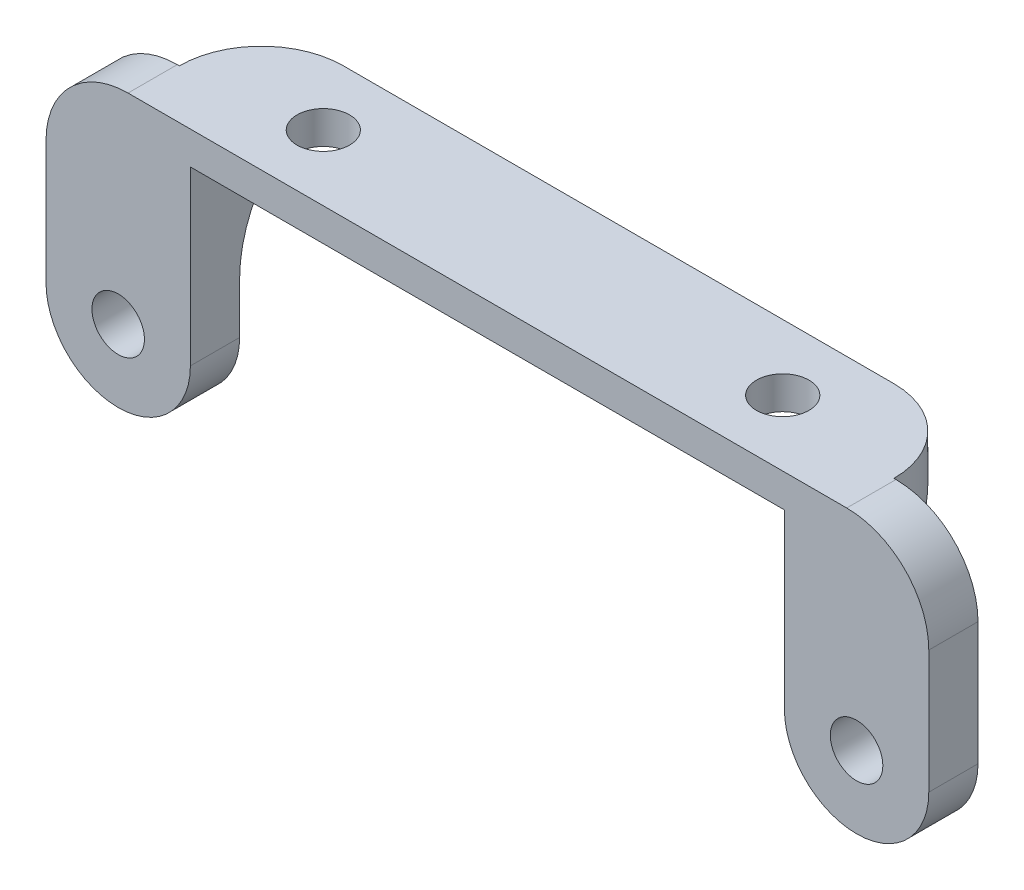
ISO-10303-21;
HEADER;
FILE_DESCRIPTION(('STEP AP214'),'2;1');
FILE_NAME('part.step','',(''),(''),'','','');
FILE_SCHEMA(('AUTOMOTIVE_DESIGN { 1 0 10303 214 1 1 1 1 }'));
ENDSEC;
DATA;
#1=APPLICATION_CONTEXT('core data for automotive mechanical design processes');
#2=APPLICATION_PROTOCOL_DEFINITION('international standard','automotive_design',2000,#1);
#3=PRODUCT_CONTEXT('',#1,'mechanical');
#4=PRODUCT('Part','Part','',(#3));
#5=PRODUCT_RELATED_PRODUCT_CATEGORY('part','',(#4));
#6=PRODUCT_DEFINITION_FORMATION('','',#4);
#7=PRODUCT_DEFINITION_CONTEXT('part definition',#1,'design');
#8=PRODUCT_DEFINITION('design','',#6,#7);
#9=PRODUCT_DEFINITION_SHAPE('','',#8);
#10=(LENGTH_UNIT() NAMED_UNIT(*) SI_UNIT(.MILLI.,.METRE.));
#11=(NAMED_UNIT(*) PLANE_ANGLE_UNIT() SI_UNIT($,.RADIAN.));
#12=(NAMED_UNIT(*) SI_UNIT($,.STERADIAN.) SOLID_ANGLE_UNIT());
#13=UNCERTAINTY_MEASURE_WITH_UNIT(LENGTH_MEASURE(1.E-05),#10,'distance_accuracy_value','');
#14=(GEOMETRIC_REPRESENTATION_CONTEXT(3) GLOBAL_UNCERTAINTY_ASSIGNED_CONTEXT((#13)) GLOBAL_UNIT_ASSIGNED_CONTEXT((#10,
#11,#12)) REPRESENTATION_CONTEXT('',''));
#15=CARTESIAN_POINT('',(0.,0.,0.));
#16=DIRECTION('',(0.,0.,1.));
#17=DIRECTION('',(1.,0.,0.));
#18=AXIS2_PLACEMENT_3D('',#15,#16,#17);
#19=CARTESIAN_POINT('',(0.,10.5,0.));
#20=DIRECTION('',(0.,-1.,0.));
#21=DIRECTION('',(0.,0.,-1.));
#22=AXIS2_PLACEMENT_3D('',#19,#20,#21);
#23=PLANE('',#22);
#24=CARTESIAN_POINT('',(14.,10.5,-0.999999999999999));
#25=DIRECTION('',(0.,1.,0.));
#26=DIRECTION('',(0.,0.,1.));
#27=AXIS2_PLACEMENT_3D('',#24,#25,#26);
#28=CIRCLE('',#27,1.6);
#29=CARTESIAN_POINT('',(14.,10.5,0.600000000000001));
#30=VERTEX_POINT('',#29);
#31=EDGE_CURVE('E198',#30,#30,#28,.T.);
#32=ORIENTED_EDGE('',*,*,#31,.T.);
#33=EDGE_LOOP('',(#32));
#34=FACE_BOUND('',#33,.T.);
#35=CARTESIAN_POINT('',(-14.,10.5,-0.999999999999999));
#36=DIRECTION('',(0.,1.,0.));
#37=DIRECTION('',(0.,0.,1.));
#38=AXIS2_PLACEMENT_3D('',#35,#36,#37);
#39=CIRCLE('',#38,1.6);
#40=CARTESIAN_POINT('',(-14.,10.5,0.600000000000001));
#41=VERTEX_POINT('',#40);
#42=EDGE_CURVE('E192',#41,#41,#39,.T.);
#43=ORIENTED_EDGE('',*,*,#42,.T.);
#44=EDGE_LOOP('',(#43));
#45=FACE_BOUND('',#44,.T.);
#46=DIRECTION('',(0.,0.,-1.));
#47=VECTOR('',#46,1.);
#48=CARTESIAN_POINT('',(-18.1,10.5,3.));
#49=LINE('',#48,#47);
#50=CARTESIAN_POINT('',(-18.1,10.5,3.));
#51=VERTEX_POINT('',#50);
#52=CARTESIAN_POINT('',(-18.1,10.5,-4.82124205988457));
#53=VERTEX_POINT('',#52);
#54=EDGE_CURVE('E241',#51,#53,#49,.T.);
#55=ORIENTED_EDGE('',*,*,#54,.T.);
#56=CARTESIAN_POINT('',(-16.775,10.5,0.));
#57=DIRECTION('',(0.,-1.,0.));
#58=DIRECTION('',(0.,0.,-1.));
#59=AXIS2_PLACEMENT_3D('',#56,#57,#58);
#60=CIRCLE('',#59,5.);
#61=CARTESIAN_POINT('',(-16.775,10.5,-5.));
#62=VERTEX_POINT('',#61);
#63=EDGE_CURVE('E282',#53,#62,#60,.T.);
#64=ORIENTED_EDGE('',*,*,#63,.T.);
#65=DIRECTION('',(-1.,0.,0.));
#66=VECTOR('',#65,1.);
#67=CARTESIAN_POINT('',(-21.775,10.5,-5.));
#68=LINE('',#67,#66);
#69=CARTESIAN_POINT('',(16.775,10.5,-5.));
#70=VERTEX_POINT('',#69);
#71=EDGE_CURVE('E211',#70,#62,#68,.T.);
#72=ORIENTED_EDGE('',*,*,#71,.F.);
#73=CARTESIAN_POINT('',(16.775,10.5,0.));
#74=DIRECTION('',(0.,-1.,0.));
#75=DIRECTION('',(0.,0.,-1.));
#76=AXIS2_PLACEMENT_3D('',#73,#74,#75);
#77=CIRCLE('',#76,5.);
#78=CARTESIAN_POINT('',(18.1,10.5,-4.82124205988457));
#79=VERTEX_POINT('',#78);
#80=EDGE_CURVE('E279',#70,#79,#77,.T.);
#81=ORIENTED_EDGE('',*,*,#80,.T.);
#82=DIRECTION('',(0.,0.,-1.));
#83=VECTOR('',#82,1.);
#84=CARTESIAN_POINT('',(18.1,10.5,3.));
#85=LINE('',#84,#83);
#86=CARTESIAN_POINT('',(18.1,10.5,3.));
#87=VERTEX_POINT('',#86);
#88=EDGE_CURVE('E181',#87,#79,#85,.T.);
#89=ORIENTED_EDGE('',*,*,#88,.F.);
#90=DIRECTION('',(1.,0.,0.));
#91=VECTOR('',#90,1.);
#92=CARTESIAN_POINT('',(12.2208649793369,10.5,3.));
#93=LINE('',#92,#91);
#94=EDGE_CURVE('E204',#51,#87,#93,.T.);
#95=ORIENTED_EDGE('',*,*,#94,.F.);
#96=EDGE_LOOP('',(#55,#64,#72,#81,#89,#95));
#97=FACE_BOUND('',#96,.T.);
#98=ADVANCED_FACE('F39',(#34,#45,#97),#23,.T.);
#99=CARTESIAN_POINT('',(-22.5,0.,3.));
#100=DIRECTION('',(0.,0.,-1.));
#101=DIRECTION('',(-1.,0.,0.));
#102=AXIS2_PLACEMENT_3D('',#99,#100,#101);
#103=CYLINDRICAL_SURFACE('',#102,4.4);
#104=DIRECTION('',(0.,0.,-1.));
#105=VECTOR('',#104,1.);
#106=CARTESIAN_POINT('',(-18.1,0.,3.));
#107=LINE('',#106,#105);
#108=CARTESIAN_POINT('',(-18.1,0.,3.));
#109=VERTEX_POINT('',#108);
#110=CARTESIAN_POINT('',(-18.1,0.,0.));
#111=VERTEX_POINT('',#110);
#112=EDGE_CURVE('E243',#109,#111,#107,.T.);
#113=ORIENTED_EDGE('',*,*,#112,.F.);
#114=CARTESIAN_POINT('',(-22.5,0.,3.));
#115=DIRECTION('',(0.,0.,1.));
#116=DIRECTION('',(-1.,0.,0.));
#117=AXIS2_PLACEMENT_3D('',#114,#115,#116);
#118=CIRCLE('',#117,4.4);
#119=CARTESIAN_POINT('',(-26.9,0.,3.));
#120=VERTEX_POINT('',#119);
#121=EDGE_CURVE('E253',#120,#109,#118,.T.);
#122=ORIENTED_EDGE('',*,*,#121,.F.);
#123=DIRECTION('',(0.,0.,-1.));
#124=VECTOR('',#123,1.);
#125=CARTESIAN_POINT('',(-26.9,0.,3.));
#126=LINE('',#125,#124);
#127=CARTESIAN_POINT('',(-26.9,0.,0.));
#128=VERTEX_POINT('',#127);
#129=EDGE_CURVE('E236',#120,#128,#126,.T.);
#130=ORIENTED_EDGE('',*,*,#129,.T.);
#131=CARTESIAN_POINT('',(-22.5,0.,0.));
#132=DIRECTION('',(0.,0.,1.));
#133=DIRECTION('',(-1.,0.,0.));
#134=AXIS2_PLACEMENT_3D('',#131,#132,#133);
#135=CIRCLE('',#134,4.4);
#136=EDGE_CURVE('E250',#128,#111,#135,.T.);
#137=ORIENTED_EDGE('',*,*,#136,.T.);
#138=EDGE_LOOP('',(#113,#122,#130,#137));
#139=FACE_BOUND('',#138,.T.);
#140=ADVANCED_FACE('F339',(#139),#103,.T.);
#141=CARTESIAN_POINT('',(-22.5,0.,3.));
#142=DIRECTION('',(0.,0.,-1.));
#143=DIRECTION('',(-1.,0.,0.));
#144=AXIS2_PLACEMENT_3D('',#141,#142,#143);
#145=PLANE('',#144);
#146=DIRECTION('',(0.,-1.,0.));
#147=VECTOR('',#146,1.);
#148=CARTESIAN_POINT('',(26.9,12.5,3.));
#149=LINE('',#148,#147);
#150=CARTESIAN_POINT('',(26.9,7.5,3.));
#151=VERTEX_POINT('',#150);
#152=CARTESIAN_POINT('',(26.9,0.,3.));
#153=VERTEX_POINT('',#152);
#154=EDGE_CURVE('E228',#151,#153,#149,.T.);
#155=ORIENTED_EDGE('',*,*,#154,.F.);
#156=CARTESIAN_POINT('',(21.9,7.5,3.));
#157=DIRECTION('',(0.,0.,-1.));
#158=DIRECTION('',(-1.,0.,0.));
#159=AXIS2_PLACEMENT_3D('',#156,#157,#158);
#160=CIRCLE('',#159,5.);
#161=CARTESIAN_POINT('',(21.9,12.5,3.));
#162=VERTEX_POINT('',#161);
#163=EDGE_CURVE('E273',#151,#162,#160,.F.);
#164=ORIENTED_EDGE('',*,*,#163,.T.);
#165=DIRECTION('',(1.,0.,0.));
#166=VECTOR('',#165,1.);
#167=CARTESIAN_POINT('',(-12.2208649793369,12.5,3.));
#168=LINE('',#167,#166);
#169=CARTESIAN_POINT('',(-21.9,12.5,3.));
#170=VERTEX_POINT('',#169);
#171=EDGE_CURVE('E210',#170,#162,#168,.T.);
#172=ORIENTED_EDGE('',*,*,#171,.F.);
#173=CARTESIAN_POINT('',(-21.9,7.5,3.));
#174=DIRECTION('',(0.,0.,-1.));
#175=DIRECTION('',(-1.,0.,0.));
#176=AXIS2_PLACEMENT_3D('',#173,#174,#175);
#177=CIRCLE('',#176,5.);
#178=CARTESIAN_POINT('',(-26.9,7.5,3.));
#179=VERTEX_POINT('',#178);
#180=EDGE_CURVE('E271',#170,#179,#177,.F.);
#181=ORIENTED_EDGE('',*,*,#180,.T.);
#182=DIRECTION('',(0.,-1.,0.));
#183=VECTOR('',#182,1.);
#184=CARTESIAN_POINT('',(-26.9,0.,3.));
#185=LINE('',#184,#183);
#186=EDGE_CURVE('E233',#179,#120,#185,.T.);
#187=ORIENTED_EDGE('',*,*,#186,.T.);
#188=ORIENTED_EDGE('',*,*,#121,.T.);
#189=DIRECTION('',(0.,1.,0.));
#190=VECTOR('',#189,1.);
#191=CARTESIAN_POINT('',(-18.1,10.5,3.));
#192=LINE('',#191,#190);
#193=EDGE_CURVE('E231',#109,#51,#192,.T.);
#194=ORIENTED_EDGE('',*,*,#193,.T.);
#195=ORIENTED_EDGE('',*,*,#94,.T.);
#196=DIRECTION('',(0.,-1.,0.));
#197=VECTOR('',#196,1.);
#198=CARTESIAN_POINT('',(18.1,10.5,3.));
#199=LINE('',#198,#197);
#200=CARTESIAN_POINT('',(18.1,0.,3.));
#201=VERTEX_POINT('',#200);
#202=EDGE_CURVE('E165',#87,#201,#199,.T.);
#203=ORIENTED_EDGE('',*,*,#202,.T.);
#204=CARTESIAN_POINT('',(22.5,0.,3.));
#205=DIRECTION('',(0.,0.,1.));
#206=DIRECTION('',(1.,0.,0.));
#207=AXIS2_PLACEMENT_3D('',#204,#205,#206);
#208=CIRCLE('',#207,4.4);
#209=EDGE_CURVE('E164',#201,#153,#208,.T.);
#210=ORIENTED_EDGE('',*,*,#209,.T.);
#211=EDGE_LOOP('',(#155,#164,#172,#181,#187,#188,#194,#195,#203,#210));
#212=FACE_BOUND('',#211,.T.);
#213=CARTESIAN_POINT('',(-22.5,0.,3.));
#214=DIRECTION('',(0.,0.,1.));
#215=DIRECTION('',(-1.,0.,0.));
#216=AXIS2_PLACEMENT_3D('',#213,#214,#215);
#217=CIRCLE('',#216,1.6);
#218=CARTESIAN_POINT('',(-24.1,0.,3.));
#219=VERTEX_POINT('',#218);
#220=EDGE_CURVE('E247',#219,#219,#217,.T.);
#221=ORIENTED_EDGE('',*,*,#220,.F.);
#222=EDGE_LOOP('',(#221));
#223=FACE_BOUND('',#222,.T.);
#224=CARTESIAN_POINT('',(22.5,0.,3.));
#225=DIRECTION('',(0.,0.,1.));
#226=DIRECTION('',(1.,0.,0.));
#227=AXIS2_PLACEMENT_3D('',#224,#225,#226);
#228=CIRCLE('',#227,1.6);
#229=CARTESIAN_POINT('',(24.1,0.,3.));
#230=VERTEX_POINT('',#229);
#231=EDGE_CURVE('E176',#230,#230,#228,.T.);
#232=ORIENTED_EDGE('',*,*,#231,.F.);
#233=EDGE_LOOP('',(#232));
#234=FACE_BOUND('',#233,.T.);
#235=ADVANCED_FACE('F343',(#212,#223,#234),#145,.F.);
#236=CARTESIAN_POINT('',(-22.5,0.,0.));
#237=DIRECTION('',(0.,0.,-1.));
#238=DIRECTION('',(-1.,0.,0.));
#239=AXIS2_PLACEMENT_3D('',#236,#237,#238);
#240=PLANE('',#239);
#241=DIRECTION('',(0.,-1.,0.));
#242=VECTOR('',#241,1.);
#243=CARTESIAN_POINT('',(-21.775,12.5,0.));
#244=LINE('',#243,#242);
#245=CARTESIAN_POINT('',(-21.775,12.5,0.));
#246=VERTEX_POINT('',#245);
#247=CARTESIAN_POINT('',(-21.775,3.08380151290434,0.));
#248=VERTEX_POINT('',#247);
#249=EDGE_CURVE('E219',#246,#248,#244,.T.);
#250=ORIENTED_EDGE('',*,*,#249,.T.);
#251=DIRECTION('',(1.,0.,0.));
#252=VECTOR('',#251,1.);
#253=CARTESIAN_POINT('',(-18.1,3.08380151290434,0.));
#254=LINE('',#253,#252);
#255=CARTESIAN_POINT('',(-18.1,3.08380151290434,0.));
#256=VERTEX_POINT('',#255);
#257=EDGE_CURVE('E289',#248,#256,#254,.T.);
#258=ORIENTED_EDGE('',*,*,#257,.T.);
#259=DIRECTION('',(0.,1.,0.));
#260=VECTOR('',#259,1.);
#261=CARTESIAN_POINT('',(-18.1,10.5,0.));
#262=LINE('',#261,#260);
#263=EDGE_CURVE('E230',#111,#256,#262,.T.);
#264=ORIENTED_EDGE('',*,*,#263,.F.);
#265=ORIENTED_EDGE('',*,*,#136,.F.);
#266=DIRECTION('',(0.,-1.,0.));
#267=VECTOR('',#266,1.);
#268=CARTESIAN_POINT('',(-26.9,0.,0.));
#269=LINE('',#268,#267);
#270=CARTESIAN_POINT('',(-26.9,7.5,0.));
#271=VERTEX_POINT('',#270);
#272=EDGE_CURVE('E234',#271,#128,#269,.T.);
#273=ORIENTED_EDGE('',*,*,#272,.F.);
#274=CARTESIAN_POINT('',(-21.9,7.5,0.));
#275=DIRECTION('',(0.,0.,-1.));
#276=DIRECTION('',(-1.,0.,0.));
#277=AXIS2_PLACEMENT_3D('',#274,#275,#276);
#278=CIRCLE('',#277,5.);
#279=CARTESIAN_POINT('',(-21.9,12.5,0.));
#280=VERTEX_POINT('',#279);
#281=EDGE_CURVE('E277',#271,#280,#278,.T.);
#282=ORIENTED_EDGE('',*,*,#281,.T.);
#283=DIRECTION('',(-1.,0.,0.));
#284=VECTOR('',#283,1.);
#285=CARTESIAN_POINT('',(-26.9,12.5,0.));
#286=LINE('',#285,#284);
#287=EDGE_CURVE('E207',#246,#280,#286,.T.);
#288=ORIENTED_EDGE('',*,*,#287,.F.);
#289=EDGE_LOOP('',(#250,#258,#264,#265,#273,#282,#288));
#290=FACE_BOUND('',#289,.T.);
#291=CARTESIAN_POINT('',(-22.5,0.,0.));
#292=DIRECTION('',(0.,0.,1.));
#293=DIRECTION('',(-1.,0.,0.));
#294=AXIS2_PLACEMENT_3D('',#291,#292,#293);
#295=CIRCLE('',#294,1.6);
#296=CARTESIAN_POINT('',(-24.1,0.,0.));
#297=VERTEX_POINT('',#296);
#298=EDGE_CURVE('E246',#297,#297,#295,.T.);
#299=ORIENTED_EDGE('',*,*,#298,.T.);
#300=EDGE_LOOP('',(#299));
#301=FACE_BOUND('',#300,.T.);
#302=ADVANCED_FACE('F331',(#290,#301),#240,.T.);
#303=CARTESIAN_POINT('',(-22.5,0.,3.));
#304=DIRECTION('',(0.,0.,-1.));
#305=DIRECTION('',(-1.,0.,0.));
#306=AXIS2_PLACEMENT_3D('',#303,#304,#305);
#307=CYLINDRICAL_SURFACE('',#306,1.6);
#308=ORIENTED_EDGE('',*,*,#220,.T.);
#309=EDGE_LOOP('',(#308));
#310=FACE_BOUND('',#309,.T.);
#311=ORIENTED_EDGE('',*,*,#298,.F.);
#312=EDGE_LOOP('',(#311));
#313=FACE_BOUND('',#312,.T.);
#314=ADVANCED_FACE('F398',(#310,#313),#307,.F.);
#315=CARTESIAN_POINT('',(-18.1,10.5,3.));
#316=DIRECTION('',(-1.,0.,0.));
#317=DIRECTION('',(0.,0.,1.));
#318=AXIS2_PLACEMENT_3D('',#315,#316,#317);
#319=PLANE('',#318);
#320=ORIENTED_EDGE('',*,*,#263,.T.);
#321=CARTESIAN_POINT('',(-18.1,3.08380151290434,-8.));
#322=DIRECTION('',(-1.,0.,0.));
#323=DIRECTION('',(0.,0.,1.));
#324=AXIS2_PLACEMENT_3D('',#321,#322,#323);
#325=CIRCLE('',#324,8.);
#326=CARTESIAN_POINT('',(-18.1,10.4251568345158,-4.82124205988457));
#327=VERTEX_POINT('',#326);
#328=EDGE_CURVE('E63',#256,#327,#325,.T.);
#329=ORIENTED_EDGE('',*,*,#328,.T.);
#330=DIRECTION('',(0.,-1.,0.));
#331=VECTOR('',#330,1.);
#332=CARTESIAN_POINT('',(-18.1,10.5,-4.82124205988457));
#333=LINE('',#332,#331);
#334=EDGE_CURVE('E48',#53,#327,#333,.T.);
#335=ORIENTED_EDGE('',*,*,#334,.F.);
#336=ORIENTED_EDGE('',*,*,#54,.F.);
#337=ORIENTED_EDGE('',*,*,#193,.F.);
#338=ORIENTED_EDGE('',*,*,#112,.T.);
#339=EDGE_LOOP('',(#320,#329,#335,#336,#337,#338));
#340=FACE_BOUND('',#339,.T.);
#341=ADVANCED_FACE('F335',(#340),#319,.F.);
#342=CARTESIAN_POINT('',(-26.9,0.,3.));
#343=DIRECTION('',(1.,0.,0.));
#344=DIRECTION('',(0.,0.,-1.));
#345=AXIS2_PLACEMENT_3D('',#342,#343,#344);
#346=PLANE('',#345);
#347=ORIENTED_EDGE('',*,*,#186,.F.);
#348=DIRECTION('',(0.,0.,1.));
#349=VECTOR('',#348,1.);
#350=CARTESIAN_POINT('',(-26.9,7.5,3.));
#351=LINE('',#350,#349);
#352=EDGE_CURVE('E275',#179,#271,#351,.F.);
#353=ORIENTED_EDGE('',*,*,#352,.T.);
#354=ORIENTED_EDGE('',*,*,#272,.T.);
#355=ORIENTED_EDGE('',*,*,#129,.F.);
#356=EDGE_LOOP('',(#347,#353,#354,#355));
#357=FACE_BOUND('',#356,.T.);
#358=ADVANCED_FACE('F349',(#357),#346,.F.);
#359=CARTESIAN_POINT('',(0.,12.5,0.));
#360=DIRECTION('',(0.,-1.,0.));
#361=DIRECTION('',(0.,0.,-1.));
#362=AXIS2_PLACEMENT_3D('',#359,#360,#361);
#363=PLANE('',#362);
#364=ORIENTED_EDGE('',*,*,#171,.T.);
#365=DIRECTION('',(0.,0.,-1.));
#366=VECTOR('',#365,1.);
#367=CARTESIAN_POINT('',(21.9,12.5,0.));
#368=LINE('',#367,#366);
#369=CARTESIAN_POINT('',(21.9,12.5,0.));
#370=VERTEX_POINT('',#369);
#371=EDGE_CURVE('E264',#162,#370,#368,.T.);
#372=ORIENTED_EDGE('',*,*,#371,.T.);
#373=DIRECTION('',(-1.,0.,0.));
#374=VECTOR('',#373,1.);
#375=CARTESIAN_POINT('',(26.9,12.5,0.));
#376=LINE('',#375,#374);
#377=CARTESIAN_POINT('',(21.775,12.5,0.));
#378=VERTEX_POINT('',#377);
#379=EDGE_CURVE('E214',#370,#378,#376,.T.);
#380=ORIENTED_EDGE('',*,*,#379,.T.);
#381=CARTESIAN_POINT('',(16.775,12.5,0.));
#382=DIRECTION('',(0.,-1.,0.));
#383=DIRECTION('',(0.,0.,-1.));
#384=AXIS2_PLACEMENT_3D('',#381,#382,#383);
#385=CIRCLE('',#384,5.);
#386=CARTESIAN_POINT('',(16.775,12.5,-5.));
#387=VERTEX_POINT('',#386);
#388=EDGE_CURVE('E256',#378,#387,#385,.F.);
#389=ORIENTED_EDGE('',*,*,#388,.T.);
#390=DIRECTION('',(-1.,0.,0.));
#391=VECTOR('',#390,1.);
#392=CARTESIAN_POINT('',(-21.775,12.5,-5.));
#393=LINE('',#392,#391);
#394=CARTESIAN_POINT('',(-16.775,12.5,-5.));
#395=VERTEX_POINT('',#394);
#396=EDGE_CURVE('E216',#387,#395,#393,.T.);
#397=ORIENTED_EDGE('',*,*,#396,.T.);
#398=CARTESIAN_POINT('',(-16.775,12.5,0.));
#399=DIRECTION('',(0.,-1.,0.));
#400=DIRECTION('',(0.,0.,-1.));
#401=AXIS2_PLACEMENT_3D('',#398,#399,#400);
#402=CIRCLE('',#401,5.);
#403=EDGE_CURVE('E259',#395,#246,#402,.F.);
#404=ORIENTED_EDGE('',*,*,#403,.T.);
#405=ORIENTED_EDGE('',*,*,#287,.T.);
#406=DIRECTION('',(0.,0.,1.));
#407=VECTOR('',#406,1.);
#408=CARTESIAN_POINT('',(-21.9,12.5,0.));
#409=LINE('',#408,#407);
#410=EDGE_CURVE('E261',#280,#170,#409,.T.);
#411=ORIENTED_EDGE('',*,*,#410,.T.);
#412=EDGE_LOOP('',(#364,#372,#380,#389,#397,#404,#405,#411));
#413=FACE_BOUND('',#412,.T.);
#414=CARTESIAN_POINT('',(14.,12.5,-0.999999999999999));
#415=DIRECTION('',(0.,1.,0.));
#416=DIRECTION('',(0.,0.,1.));
#417=AXIS2_PLACEMENT_3D('',#414,#415,#416);
#418=CIRCLE('',#417,1.6);
#419=CARTESIAN_POINT('',(14.,12.5,0.600000000000001));
#420=VERTEX_POINT('',#419);
#421=EDGE_CURVE('E201',#420,#420,#418,.T.);
#422=ORIENTED_EDGE('',*,*,#421,.F.);
#423=EDGE_LOOP('',(#422));
#424=FACE_BOUND('',#423,.T.);
#425=CARTESIAN_POINT('',(-14.,12.5,-0.999999999999999));
#426=DIRECTION('',(0.,1.,0.));
#427=DIRECTION('',(0.,0.,1.));
#428=AXIS2_PLACEMENT_3D('',#425,#426,#427);
#429=CIRCLE('',#428,1.6);
#430=CARTESIAN_POINT('',(-14.,12.5,0.600000000000001));
#431=VERTEX_POINT('',#430);
#432=EDGE_CURVE('E195',#431,#431,#429,.T.);
#433=ORIENTED_EDGE('',*,*,#432,.F.);
#434=EDGE_LOOP('',(#433));
#435=FACE_BOUND('',#434,.T.);
#436=ADVANCED_FACE('F355',(#413,#424,#435),#363,.F.);
#437=CARTESIAN_POINT('',(26.9,12.5,3.));
#438=DIRECTION('',(-1.,0.,0.));
#439=DIRECTION('',(0.,0.,1.));
#440=AXIS2_PLACEMENT_3D('',#437,#438,#439);
#441=PLANE('',#440);
#442=DIRECTION('',(0.,-1.,0.));
#443=VECTOR('',#442,1.);
#444=CARTESIAN_POINT('',(26.9,12.5,0.));
#445=LINE('',#444,#443);
#446=CARTESIAN_POINT('',(26.9,7.5,0.));
#447=VERTEX_POINT('',#446);
#448=CARTESIAN_POINT('',(26.9,0.,0.));
#449=VERTEX_POINT('',#448);
#450=EDGE_CURVE('E172',#447,#449,#445,.T.);
#451=ORIENTED_EDGE('',*,*,#450,.F.);
#452=DIRECTION('',(0.,0.,-1.));
#453=VECTOR('',#452,1.);
#454=CARTESIAN_POINT('',(26.9,7.5,3.));
#455=LINE('',#454,#453);
#456=EDGE_CURVE('E269',#447,#151,#455,.F.);
#457=ORIENTED_EDGE('',*,*,#456,.T.);
#458=ORIENTED_EDGE('',*,*,#154,.T.);
#459=DIRECTION('',(0.,0.,-1.));
#460=VECTOR('',#459,1.);
#461=CARTESIAN_POINT('',(26.9,0.,3.));
#462=LINE('',#461,#460);
#463=EDGE_CURVE('E184',#153,#449,#462,.T.);
#464=ORIENTED_EDGE('',*,*,#463,.T.);
#465=EDGE_LOOP('',(#451,#457,#458,#464));
#466=FACE_BOUND('',#465,.T.);
#467=ADVANCED_FACE('F390',(#466),#441,.F.);
#468=CARTESIAN_POINT('',(26.9,12.5,0.));
#469=DIRECTION('',(0.,0.,1.));
#470=DIRECTION('',(1.,0.,0.));
#471=AXIS2_PLACEMENT_3D('',#468,#469,#470);
#472=PLANE('',#471);
#473=DIRECTION('',(0.,-1.,0.));
#474=VECTOR('',#473,1.);
#475=CARTESIAN_POINT('',(18.1,10.5,0.));
#476=LINE('',#475,#474);
#477=CARTESIAN_POINT('',(18.1,3.08380151290434,0.));
#478=VERTEX_POINT('',#477);
#479=CARTESIAN_POINT('',(18.1,0.,0.));
#480=VERTEX_POINT('',#479);
#481=EDGE_CURVE('E154',#478,#480,#476,.T.);
#482=ORIENTED_EDGE('',*,*,#481,.F.);
#483=DIRECTION('',(-1.,0.,0.));
#484=VECTOR('',#483,1.);
#485=CARTESIAN_POINT('',(26.9,3.08380151290434,0.));
#486=LINE('',#485,#484);
#487=CARTESIAN_POINT('',(21.775,3.08380151290434,0.));
#488=VERTEX_POINT('',#487);
#489=EDGE_CURVE('E292',#478,#488,#486,.F.);
#490=ORIENTED_EDGE('',*,*,#489,.T.);
#491=DIRECTION('',(0.,-1.,0.));
#492=VECTOR('',#491,1.);
#493=CARTESIAN_POINT('',(21.775,12.5,0.));
#494=LINE('',#493,#492);
#495=EDGE_CURVE('E225',#378,#488,#494,.T.);
#496=ORIENTED_EDGE('',*,*,#495,.F.);
#497=ORIENTED_EDGE('',*,*,#379,.F.);
#498=CARTESIAN_POINT('',(21.9,7.5,0.));
#499=DIRECTION('',(0.,0.,1.));
#500=DIRECTION('',(1.,0.,0.));
#501=AXIS2_PLACEMENT_3D('',#498,#499,#500);
#502=CIRCLE('',#501,5.);
#503=EDGE_CURVE('E267',#370,#447,#502,.F.);
#504=ORIENTED_EDGE('',*,*,#503,.T.);
#505=ORIENTED_EDGE('',*,*,#450,.T.);
#506=CARTESIAN_POINT('',(22.5,0.,0.));
#507=DIRECTION('',(0.,0.,1.));
#508=DIRECTION('',(1.,0.,0.));
#509=AXIS2_PLACEMENT_3D('',#506,#507,#508);
#510=CIRCLE('',#509,4.4);
#511=EDGE_CURVE('E168',#480,#449,#510,.T.);
#512=ORIENTED_EDGE('',*,*,#511,.F.);
#513=EDGE_LOOP('',(#482,#490,#496,#497,#504,#505,#512));
#514=FACE_BOUND('',#513,.T.);
#515=CARTESIAN_POINT('',(22.5,0.,0.));
#516=DIRECTION('',(0.,0.,1.));
#517=DIRECTION('',(1.,0.,0.));
#518=AXIS2_PLACEMENT_3D('',#515,#516,#517);
#519=CIRCLE('',#518,1.6);
#520=CARTESIAN_POINT('',(24.1,0.,0.));
#521=VERTEX_POINT('',#520);
#522=EDGE_CURVE('E189',#521,#521,#519,.T.);
#523=ORIENTED_EDGE('',*,*,#522,.T.);
#524=EDGE_LOOP('',(#523));
#525=FACE_BOUND('',#524,.T.);
#526=ADVANCED_FACE('F169',(#514,#525),#472,.F.);
#527=CARTESIAN_POINT('',(-21.775,12.5,-5.));
#528=DIRECTION('',(0.,0.,1.));
#529=DIRECTION('',(1.,0.,0.));
#530=AXIS2_PLACEMENT_3D('',#527,#528,#529);
#531=PLANE('',#530);
#532=ORIENTED_EDGE('',*,*,#71,.T.);
#533=DIRECTION('',(0.,-1.,0.));
#534=VECTOR('',#533,1.);
#535=CARTESIAN_POINT('',(-16.775,12.5,-5.));
#536=LINE('',#535,#534);
#537=EDGE_CURVE('E287',#62,#395,#536,.F.);
#538=ORIENTED_EDGE('',*,*,#537,.T.);
#539=ORIENTED_EDGE('',*,*,#396,.F.);
#540=DIRECTION('',(0.,-1.,0.));
#541=VECTOR('',#540,1.);
#542=CARTESIAN_POINT('',(16.775,12.5,-5.));
#543=LINE('',#542,#541);
#544=EDGE_CURVE('E284',#387,#70,#543,.T.);
#545=ORIENTED_EDGE('',*,*,#544,.T.);
#546=EDGE_LOOP('',(#532,#538,#539,#545));
#547=FACE_BOUND('',#546,.T.);
#548=ADVANCED_FACE('F359',(#547),#531,.F.);
#549=CARTESIAN_POINT('',(14.,12.5,-0.999999999999999));
#550=DIRECTION('',(0.,-1.,0.));
#551=DIRECTION('',(0.,0.,-1.));
#552=AXIS2_PLACEMENT_3D('',#549,#550,#551);
#553=CYLINDRICAL_SURFACE('',#552,1.6);
#554=ORIENTED_EDGE('',*,*,#421,.T.);
#555=EDGE_LOOP('',(#554));
#556=FACE_BOUND('',#555,.T.);
#557=ORIENTED_EDGE('',*,*,#31,.F.);
#558=EDGE_LOOP('',(#557));
#559=FACE_BOUND('',#558,.T.);
#560=ADVANCED_FACE('F387',(#556,#559),#553,.F.);
#561=CARTESIAN_POINT('',(-14.,12.5,-0.999999999999999));
#562=DIRECTION('',(0.,-1.,0.));
#563=DIRECTION('',(0.,0.,-1.));
#564=AXIS2_PLACEMENT_3D('',#561,#562,#563);
#565=CYLINDRICAL_SURFACE('',#564,1.6);
#566=ORIENTED_EDGE('',*,*,#432,.T.);
#567=EDGE_LOOP('',(#566));
#568=FACE_BOUND('',#567,.T.);
#569=ORIENTED_EDGE('',*,*,#42,.F.);
#570=EDGE_LOOP('',(#569));
#571=FACE_BOUND('',#570,.T.);
#572=ADVANCED_FACE('F423',(#568,#571),#565,.F.);
#573=CARTESIAN_POINT('',(22.5,0.,3.));
#574=DIRECTION('',(0.,0.,-1.));
#575=DIRECTION('',(-1.,0.,0.));
#576=AXIS2_PLACEMENT_3D('',#573,#574,#575);
#577=CYLINDRICAL_SURFACE('',#576,4.4);
#578=ORIENTED_EDGE('',*,*,#463,.F.);
#579=ORIENTED_EDGE('',*,*,#209,.F.);
#580=DIRECTION('',(0.,0.,-1.));
#581=VECTOR('',#580,1.);
#582=CARTESIAN_POINT('',(18.1,0.,3.));
#583=LINE('',#582,#581);
#584=EDGE_CURVE('E158',#201,#480,#583,.T.);
#585=ORIENTED_EDGE('',*,*,#584,.T.);
#586=ORIENTED_EDGE('',*,*,#511,.T.);
#587=EDGE_LOOP('',(#578,#579,#585,#586));
#588=FACE_BOUND('',#587,.T.);
#589=ADVANCED_FACE('F178',(#588),#577,.T.);
#590=CARTESIAN_POINT('',(22.5,0.,3.));
#591=DIRECTION('',(0.,0.,-1.));
#592=DIRECTION('',(-1.,0.,0.));
#593=AXIS2_PLACEMENT_3D('',#590,#591,#592);
#594=CYLINDRICAL_SURFACE('',#593,1.6);
#595=ORIENTED_EDGE('',*,*,#231,.T.);
#596=EDGE_LOOP('',(#595));
#597=FACE_BOUND('',#596,.T.);
#598=ORIENTED_EDGE('',*,*,#522,.F.);
#599=EDGE_LOOP('',(#598));
#600=FACE_BOUND('',#599,.T.);
#601=ADVANCED_FACE('F412',(#597,#600),#594,.F.);
#602=CARTESIAN_POINT('',(18.1,10.5,3.));
#603=DIRECTION('',(1.,0.,0.));
#604=DIRECTION('',(0.,0.,-1.));
#605=AXIS2_PLACEMENT_3D('',#602,#603,#604);
#606=PLANE('',#605);
#607=ORIENTED_EDGE('',*,*,#88,.T.);
#608=DIRECTION('',(0.,-1.,0.));
#609=VECTOR('',#608,1.);
#610=CARTESIAN_POINT('',(18.1,10.4251568345158,-4.82124205988457));
#611=LINE('',#610,#609);
#612=CARTESIAN_POINT('',(18.1,10.4251568345158,-4.82124205988457));
#613=VERTEX_POINT('',#612);
#614=EDGE_CURVE('E11',#79,#613,#611,.T.);
#615=ORIENTED_EDGE('',*,*,#614,.T.);
#616=CARTESIAN_POINT('',(18.1,3.08380151290434,-8.));
#617=DIRECTION('',(1.,0.,0.));
#618=DIRECTION('',(0.,0.,-1.));
#619=AXIS2_PLACEMENT_3D('',#616,#617,#618);
#620=CIRCLE('',#619,8.);
#621=EDGE_CURVE('E160',#613,#478,#620,.T.);
#622=ORIENTED_EDGE('',*,*,#621,.T.);
#623=ORIENTED_EDGE('',*,*,#481,.T.);
#624=ORIENTED_EDGE('',*,*,#584,.F.);
#625=ORIENTED_EDGE('',*,*,#202,.F.);
#626=EDGE_LOOP('',(#607,#615,#622,#623,#624,#625));
#627=FACE_BOUND('',#626,.T.);
#628=ADVANCED_FACE('F156',(#627),#606,.F.);
#629=CARTESIAN_POINT('',(21.9,7.5,0.));
#630=DIRECTION('',(0.,0.,-1.));
#631=DIRECTION('',(-1.,0.,0.));
#632=AXIS2_PLACEMENT_3D('',#629,#630,#631);
#633=CYLINDRICAL_SURFACE('',#632,5.);
#634=ORIENTED_EDGE('',*,*,#163,.F.);
#635=ORIENTED_EDGE('',*,*,#456,.F.);
#636=ORIENTED_EDGE('',*,*,#503,.F.);
#637=ORIENTED_EDGE('',*,*,#371,.F.);
#638=EDGE_LOOP('',(#634,#635,#636,#637));
#639=FACE_BOUND('',#638,.T.);
#640=ADVANCED_FACE('F405',(#639),#633,.T.);
#641=CARTESIAN_POINT('',(-21.9,7.5,0.));
#642=DIRECTION('',(0.,0.,1.));
#643=DIRECTION('',(1.,0.,0.));
#644=AXIS2_PLACEMENT_3D('',#641,#642,#643);
#645=CYLINDRICAL_SURFACE('',#644,5.);
#646=ORIENTED_EDGE('',*,*,#281,.F.);
#647=ORIENTED_EDGE('',*,*,#352,.F.);
#648=ORIENTED_EDGE('',*,*,#180,.F.);
#649=ORIENTED_EDGE('',*,*,#410,.F.);
#650=EDGE_LOOP('',(#646,#647,#648,#649));
#651=FACE_BOUND('',#650,.T.);
#652=ADVANCED_FACE('F311',(#651),#645,.T.);
#653=CARTESIAN_POINT('',(-16.775,12.5,0.));
#654=DIRECTION('',(0.,-1.,0.));
#655=DIRECTION('',(0.,0.,-1.));
#656=AXIS2_PLACEMENT_3D('',#653,#654,#655);
#657=CYLINDRICAL_SURFACE('',#656,5.);
#658=ORIENTED_EDGE('',*,*,#403,.F.);
#659=ORIENTED_EDGE('',*,*,#537,.F.);
#660=ORIENTED_EDGE('',*,*,#63,.F.);
#661=ORIENTED_EDGE('',*,*,#334,.T.);
#662=CARTESIAN_POINT('',(-18.1,10.4251568345158,-4.82124205988457));
#663=CARTESIAN_POINT('',(-18.2217516993891,10.4106614624058,-4.78780522040136));
#664=CARTESIAN_POINT('',(-18.3419826557652,10.3939426886128,-4.74978036433058));
#665=CARTESIAN_POINT('',(-18.5785757315123,10.3556956705287,-4.66506621686845));
#666=CARTESIAN_POINT('',(-18.694937517014,10.3341670124257,-4.61837618003823));
#667=CARTESIAN_POINT('',(-18.9228613933176,10.2859573289173,-4.51688583106656));
#668=CARTESIAN_POINT('',(-19.0344268868325,10.2592800324954,-4.46209139533553));
#669=CARTESIAN_POINT('',(-19.2520425771201,10.2003795645484,-4.34505666847657));
#670=CARTESIAN_POINT('',(-19.3580932079971,10.1681568303974,-4.28281696468221));
#671=CARTESIAN_POINT('',(-19.5641294364008,10.0977370410476,-4.15159018134643));
#672=CARTESIAN_POINT('',(-19.6641041841228,10.0595297103501,-4.08259157460996));
#673=CARTESIAN_POINT('',(-19.8571360969156,9.97686439253981,-3.93889765784963));
#674=CARTESIAN_POINT('',(-19.9501932368017,9.93240638267205,-3.86420232708794));
#675=CARTESIAN_POINT('',(-20.1287359613421,9.83707102983268,-3.71029987152442));
#676=CARTESIAN_POINT('',(-20.2142320415738,9.78620283070854,-3.63109925988517));
#677=CARTESIAN_POINT('',(-20.377404538871,9.67789264115616,-3.46927779117093));
#678=CARTESIAN_POINT('',(-20.4550826925497,9.62045211673765,-3.38665769945253));
#679=CARTESIAN_POINT('',(-20.624388116378,9.48088087375543,-3.19423603867115));
#680=CARTESIAN_POINT('',(-20.7132893726924,9.39648892479116,-3.08366096979095));
#681=CARTESIAN_POINT('',(-20.8776398847597,9.21690475892767,-2.86137533566394));
#682=CARTESIAN_POINT('',(-20.9530904203869,9.12171357101871,-2.74966487952278));
#683=CARTESIAN_POINT('',(-21.0909876149914,8.92129322053733,-2.52770552320243));
#684=CARTESIAN_POINT('',(-21.1534574255733,8.81608242584103,-2.41745435507252));
#685=CARTESIAN_POINT('',(-21.2665395119126,8.59621932248141,-2.20024576063533));
#686=CARTESIAN_POINT('',(-21.3171452047631,8.48156181968569,-2.09329019136933));
#687=CARTESIAN_POINT('',(-21.4077989778016,8.24346375212088,-1.88419637105293));
#688=CARTESIAN_POINT('',(-21.4478203513774,8.12000194911987,-1.78207082993613));
#689=CARTESIAN_POINT('',(-21.5185383385788,7.8654636239492,-1.58426085823428));
#690=CARTESIAN_POINT('',(-21.5492323035737,7.73438495144069,-1.48857826319464));
#691=CARTESIAN_POINT('',(-21.6084484667936,7.43675773546629,-1.28502836510166));
#692=CARTESIAN_POINT('',(-21.6350999468412,7.26862192186208,-1.1789359770381));
#693=CARTESIAN_POINT('',(-21.6792610974683,6.92399775920454,-0.979131076349439));
#694=CARTESIAN_POINT('',(-21.6967684357476,6.74750729172431,-0.885421726684137));
#695=CARTESIAN_POINT('',(-21.7249450362794,6.38740121459356,-0.711222609306733));
#696=CARTESIAN_POINT('',(-21.7356076413081,6.20377885189947,-0.630745768005227));
#697=CARTESIAN_POINT('',(-21.7520936097817,5.83082261516806,-0.483746874453926));
#698=CARTESIAN_POINT('',(-21.7579166531552,5.64148836422483,-0.417225745402675));
#699=CARTESIAN_POINT('',(-21.7664286838404,5.25841093574959,-0.298619976808027));
#700=CARTESIAN_POINT('',(-21.7691195188857,5.06467042638041,-0.246526839826813));
#701=CARTESIAN_POINT('',(-21.7727339705186,4.67381234456231,-0.157037097850984));
#702=CARTESIAN_POINT('',(-21.7736575457196,4.47669469313491,-0.119640837051208));
#703=CARTESIAN_POINT('',(-21.774731374361,4.08081795484612,-0.0598556161335036));
#704=CARTESIAN_POINT('',(-21.7748840836854,3.88206610395666,-0.0374191943343482));
#705=CARTESIAN_POINT('',(-21.7749823222345,3.58314171808416,-0.0149732096837804));
#706=CARTESIAN_POINT('',(-21.7749932606925,3.48336108003394,-0.00935932228832234));
#707=CARTESIAN_POINT('',(-21.7750004313718,3.2836573285149,-0.00187270770078431));
#708=CARTESIAN_POINT('',(-21.7749966632669,3.1837342119344,-6.35080408140522E-08));
#709=CARTESIAN_POINT('',(-21.775,3.08380151290434,0.));
#710=B_SPLINE_CURVE_WITH_KNOTS('',3,(#662,#663,#664,#665,#666,#667,#668,#669,#670,#671,#672,
#673,#674,#675,#676,#677,#678,#679,#680,#681,#682,#683,#684,#685,#686,#687,#688,#689,#690,#691,
#692,#693,#694,#695,#696,#697,#698,#699,#700,#701,#702,#703,#704,#705,#706,#707,#708,#709),
.UNSPECIFIED.,.F.,.F.,(4,2,2,2,2,2,2,2,2,2,2,2,2,2,2,2,2,2,2,2,2,2,2,4),(0.,0.381163381496458,
0.762359568519329,1.14328069724194,1.524171796098,1.90572419901579,2.28727799096838,
2.66829354716864,3.04922427987818,3.54349222099047,4.03771310597123,4.53104481698059,
5.02464961285765,5.51948825155812,6.01446727466359,6.61538148455912,7.21644888857301,
7.81810001171817,8.41979092275885,9.02112670771852,9.62247657487765,10.2219094006437,
10.5216641629113,10.821425575153),.UNSPECIFIED.);
#711=EDGE_CURVE('E294',#327,#248,#710,.T.);
#712=ORIENTED_EDGE('',*,*,#711,.T.);
#713=ORIENTED_EDGE('',*,*,#249,.F.);
#714=EDGE_LOOP('',(#658,#659,#660,#661,#712,#713));
#715=FACE_BOUND('',#714,.T.);
#716=ADVANCED_FACE('F306',(#715),#657,.T.);
#717=CARTESIAN_POINT('',(16.775,12.5,0.));
#718=DIRECTION('',(0.,-1.,0.));
#719=DIRECTION('',(0.,0.,-1.));
#720=AXIS2_PLACEMENT_3D('',#717,#718,#719);
#721=CYLINDRICAL_SURFACE('',#720,5.);
#722=ORIENTED_EDGE('',*,*,#388,.F.);
#723=ORIENTED_EDGE('',*,*,#495,.T.);
#724=CARTESIAN_POINT('',(21.775,3.08380151290434,0.));
#725=CARTESIAN_POINT('',(21.7749958306211,3.18939511255415,-6.3724770276237E-08));
#726=CARTESIAN_POINT('',(21.7750005322413,3.29497747638052,-0.00209090817051893));
#727=CARTESIAN_POINT('',(21.7749916047744,3.50597634529123,-0.0104494196563814));
#728=CARTESIAN_POINT('',(21.7749779757549,3.61139285098628,-0.0167170712806128));
#729=CARTESIAN_POINT('',(21.7748554990297,3.92714177654816,-0.0417751444941859));
#730=CARTESIAN_POINT('',(21.7746650861249,4.13701172208159,-0.0668206881241539));
#731=CARTESIAN_POINT('',(21.7733250912105,4.55550354655767,-0.133659686896432));
#732=CARTESIAN_POINT('',(21.7721690117454,4.76410730320302,-0.175565593751214));
#733=CARTESIAN_POINT('',(21.7676368471471,5.17730306771496,-0.275853180880394));
#734=CARTESIAN_POINT('',(21.7642607272752,5.38189501275418,-0.334235118959283));
#735=CARTESIAN_POINT('',(21.7532628392886,5.7977853420176,-0.47105390345521));
#736=CARTESIAN_POINT('',(21.745399191372,6.00875285017069,-0.550481472198958));
#737=CARTESIAN_POINT('',(21.7227024598222,6.42298525974627,-0.726726277532299));
#738=CARTESIAN_POINT('',(21.707868012689,6.62624864582018,-0.823546913945163));
#739=CARTESIAN_POINT('',(21.668257172205,7.02243223539832,-1.03313399795725));
#740=CARTESIAN_POINT('',(21.6435179574102,7.21538809324103,-1.14583980515025));
#741=CARTESIAN_POINT('',(21.580697038198,7.58964574092487,-1.3858719170561));
#742=CARTESIAN_POINT('',(21.5426235817526,7.77095465319483,-1.51318915113135));
#743=CARTESIAN_POINT('',(21.465531578657,8.05982752159818,-1.73421926265306));
#744=CARTESIAN_POINT('',(21.4313201896101,8.1713482843349,-1.82447236639179));
#745=CARTESIAN_POINT('',(21.3545971945553,8.38774006043556,-2.00930254612798));
#746=CARTESIAN_POINT('',(21.3120879006862,8.49261291542202,-2.10387841201638));
#747=CARTESIAN_POINT('',(21.2178925482883,8.69496611901032,-2.29611603711698));
#748=CARTESIAN_POINT('',(21.1662155028952,8.79245359531168,-2.3937746887128));
#749=CARTESIAN_POINT('',(21.0528887717897,8.97953796924255,-2.59086482493856));
#750=CARTESIAN_POINT('',(20.9912400929444,9.06913566211915,-2.69029612967712));
#751=CARTESIAN_POINT('',(20.8659199637257,9.22910918610269,-2.87668888182597));
#752=CARTESIAN_POINT('',(20.8034948247514,9.3004820488174,-2.96363382136818));
#753=CARTESIAN_POINT('',(20.6704586076253,9.43659038798709,-3.13644503100261));
#754=CARTESIAN_POINT('',(20.5998485164111,9.50132666290849,-3.22231142976373));
#755=CARTESIAN_POINT('',(20.4504346958299,9.62405690075354,-3.39174570153763));
#756=CARTESIAN_POINT('',(20.371629489264,9.68204964412705,-3.47531315671274));
#757=CARTESIAN_POINT('',(20.2060423796741,9.79128678701866,-3.63888589188153));
#758=CARTESIAN_POINT('',(20.11926049053,9.84253119827891,-3.71889117807326));
#759=CARTESIAN_POINT('',(19.9379467055976,9.93849299402494,-3.87428039588611));
#760=CARTESIAN_POINT('',(19.8434009789087,9.98319831752806,-3.94965564281339));
#761=CARTESIAN_POINT('',(19.647253642102,10.0662173145202,-4.09451135409827));
#762=CARTESIAN_POINT('',(19.5456521392168,10.104531085117,-4.16399190800685));
#763=CARTESIAN_POINT('',(19.336115917018,10.1750873449984,-4.29604647233188));
#764=CARTESIAN_POINT('',(19.2281836608578,10.2073321752869,-4.35862314194899));
#765=CARTESIAN_POINT('',(19.0067630877009,10.2661419750951,-4.47604006401159));
#766=CARTESIAN_POINT('',(18.8932768261677,10.2927090266394,-4.53088314982099));
#767=CARTESIAN_POINT('',(18.6681296967663,10.3392191064245,-4.6292844486784));
#768=CARTESIAN_POINT('',(18.5567309286125,10.3594525527946,-4.67330654473013));
#769=CARTESIAN_POINT('',(18.3306774056767,10.395509821814,-4.75334214219567));
#770=CARTESIAN_POINT('',(18.2160302640394,10.4113431447475,-4.78937286322042));
#771=CARTESIAN_POINT('',(18.1,10.4251568345158,-4.82124205988457));
#772=B_SPLINE_CURVE_WITH_KNOTS('',3,(#724,#725,#726,#727,#728,#729,#730,#731,#732,#733,#734,
#735,#736,#737,#738,#739,#740,#741,#742,#743,#744,#745,#746,#747,#748,#749,#750,#751,#752,#753,
#754,#755,#756,#757,#758,#759,#760,#761,#762,#763,#764,#765,#766,#767,#768,#769,#770,#771),
.UNSPECIFIED.,.F.,.F.,(4,2,2,2,2,2,2,2,2,2,2,2,2,2,2,2,2,2,2,2,2,2,2,4),(0.,0.316737661211214,
0.633474153404249,1.26683311056777,1.9044882554599,2.5421533784513,3.21796136189017,
3.89390158955322,4.56732804369369,5.24033867958594,5.68241498260783,6.12436828031163,
6.5658894622155,7.00736609013206,7.39289795241602,7.77838337571316,8.16393840497896,
8.54949276336695,8.9357495228118,9.32200041327224,9.70810200644888,10.0940617734632,
10.4581113005384,10.8213685928518),.UNSPECIFIED.);
#773=EDGE_CURVE('E55',#488,#613,#772,.T.);
#774=ORIENTED_EDGE('',*,*,#773,.T.);
#775=ORIENTED_EDGE('',*,*,#614,.F.);
#776=ORIENTED_EDGE('',*,*,#80,.F.);
#777=ORIENTED_EDGE('',*,*,#544,.F.);
#778=EDGE_LOOP('',(#722,#723,#774,#775,#776,#777));
#779=FACE_BOUND('',#778,.T.);
#780=ADVANCED_FACE('F310',(#779),#721,.T.);
#781=CARTESIAN_POINT('',(0.,3.08380151290434,-8.));
#782=DIRECTION('',(-1.,0.,0.));
#783=DIRECTION('',(0.,0.,1.));
#784=AXIS2_PLACEMENT_3D('',#781,#782,#783);
#785=CYLINDRICAL_SURFACE('',#784,8.);
#786=ORIENTED_EDGE('',*,*,#328,.F.);
#787=ORIENTED_EDGE('',*,*,#257,.F.);
#788=ORIENTED_EDGE('',*,*,#711,.F.);
#789=EDGE_LOOP('',(#786,#787,#788));
#790=FACE_BOUND('',#789,.T.);
#791=ADVANCED_FACE('F303',(#790),#785,.F.);
#792=CARTESIAN_POINT('',(0.,3.08380151290434,-8.));
#793=DIRECTION('',(-1.,0.,0.));
#794=DIRECTION('',(0.,0.,1.));
#795=AXIS2_PLACEMENT_3D('',#792,#793,#794);
#796=CYLINDRICAL_SURFACE('',#795,8.);
#797=ORIENTED_EDGE('',*,*,#773,.F.);
#798=ORIENTED_EDGE('',*,*,#489,.F.);
#799=ORIENTED_EDGE('',*,*,#621,.F.);
#800=EDGE_LOOP('',(#797,#798,#799));
#801=FACE_BOUND('',#800,.T.);
#802=ADVANCED_FACE('F41',(#801),#796,.F.);
#803=CLOSED_SHELL('',(#98,#140,#235,#302,#314,#341,#358,#436,#467,#526,#548,#560,#572,#589,#601,
#628,#640,#652,#716,#780,#791,#802));
#804=MANIFOLD_SOLID_BREP('B2',#803);
#805=ADVANCED_BREP_SHAPE_REPRESENTATION('',(#18,#804),#14);
#806=SHAPE_DEFINITION_REPRESENTATION(#9,#805);
ENDSEC;
END-ISO-10303-21;
